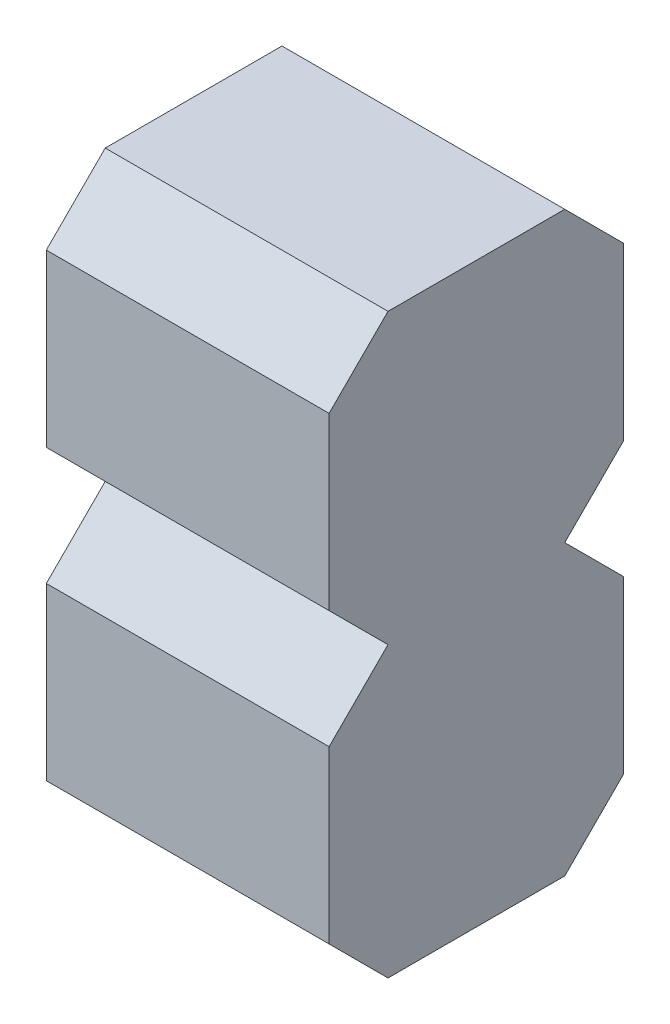
ISO-10303-21;
HEADER;
FILE_DESCRIPTION(('STEP AP214'),'2;1');
FILE_NAME('part.step','',(''),(''),'','','');
FILE_SCHEMA(('AUTOMOTIVE_DESIGN { 1 0 10303 214 1 1 1 1 }'));
ENDSEC;
DATA;
#1=APPLICATION_CONTEXT('core data for automotive mechanical design processes');
#2=APPLICATION_PROTOCOL_DEFINITION('international standard','automotive_design',2000,#1);
#3=PRODUCT_CONTEXT('',#1,'mechanical');
#4=PRODUCT('Part','Part','',(#3));
#5=PRODUCT_RELATED_PRODUCT_CATEGORY('part','',(#4));
#6=PRODUCT_DEFINITION_FORMATION('','',#4);
#7=PRODUCT_DEFINITION_CONTEXT('part definition',#1,'design');
#8=PRODUCT_DEFINITION('design','',#6,#7);
#9=PRODUCT_DEFINITION_SHAPE('','',#8);
#10=(LENGTH_UNIT() NAMED_UNIT(*) SI_UNIT(.MILLI.,.METRE.));
#11=(NAMED_UNIT(*) PLANE_ANGLE_UNIT() SI_UNIT($,.RADIAN.));
#12=(NAMED_UNIT(*) SI_UNIT($,.STERADIAN.) SOLID_ANGLE_UNIT());
#13=UNCERTAINTY_MEASURE_WITH_UNIT(LENGTH_MEASURE(1.E-05),#10,'distance_accuracy_value','');
#14=(GEOMETRIC_REPRESENTATION_CONTEXT(3) GLOBAL_UNCERTAINTY_ASSIGNED_CONTEXT((#13)) GLOBAL_UNIT_ASSIGNED_CONTEXT((#10,
#11,#12)) REPRESENTATION_CONTEXT('',''));
#15=CARTESIAN_POINT('',(0.,0.,0.));
#16=DIRECTION('',(0.,0.,1.));
#17=DIRECTION('',(1.,0.,0.));
#18=AXIS2_PLACEMENT_3D('',#15,#16,#17);
#19=CARTESIAN_POINT('',(0.,0.,0.));
#20=DIRECTION('',(0.,0.,1.));
#21=DIRECTION('',(1.,0.,0.));
#22=AXIS2_PLACEMENT_3D('',#19,#20,#21);
#23=PLANE('',#22);
#24=DIRECTION('',(0.,1.,0.));
#25=VECTOR('',#24,1.);
#26=CARTESIAN_POINT('',(0.,0.,0.));
#27=LINE('',#26,#25);
#28=CARTESIAN_POINT('',(0.,0.5,0.));
#29=VERTEX_POINT('',#28);
#30=CARTESIAN_POINT('',(0.,1.95,0.));
#31=VERTEX_POINT('',#30);
#32=EDGE_CURVE('E197',#29,#31,#27,.T.);
#33=ORIENTED_EDGE('',*,*,#32,.F.);
#34=DIRECTION('',(1.,0.,0.));
#35=VECTOR('',#34,1.);
#36=CARTESIAN_POINT('',(-2.5,0.5,0.));
#37=LINE('',#36,#35);
#38=CARTESIAN_POINT('',(-2.4,0.5,0.));
#39=VERTEX_POINT('',#38);
#40=EDGE_CURVE('E241',#39,#29,#37,.T.);
#41=ORIENTED_EDGE('',*,*,#40,.F.);
#42=DIRECTION('',(0.,-1.,0.));
#43=VECTOR('',#42,1.);
#44=CARTESIAN_POINT('',(-2.4,0.,0.));
#45=LINE('',#44,#43);
#46=CARTESIAN_POINT('',(-2.4,1.95,0.));
#47=VERTEX_POINT('',#46);
#48=EDGE_CURVE('E196',#47,#39,#45,.T.);
#49=ORIENTED_EDGE('',*,*,#48,.F.);
#50=DIRECTION('',(1.,0.,0.));
#51=VECTOR('',#50,1.);
#52=CARTESIAN_POINT('',(0.,1.95,0.));
#53=LINE('',#52,#51);
#54=EDGE_CURVE('E168',#47,#31,#53,.T.);
#55=ORIENTED_EDGE('',*,*,#54,.T.);
#56=EDGE_LOOP('',(#33,#41,#49,#55));
#57=FACE_BOUND('',#56,.T.);
#58=ADVANCED_FACE('F34',(#57),#23,.F.);
#59=CARTESIAN_POINT('',(0.,0.,2.5));
#60=DIRECTION('',(0.,0.,1.));
#61=DIRECTION('',(1.,0.,0.));
#62=AXIS2_PLACEMENT_3D('',#59,#60,#61);
#63=PLANE('',#62);
#64=DIRECTION('',(1.,0.,0.));
#65=VECTOR('',#64,1.);
#66=CARTESIAN_POINT('',(-2.5,4.39999999999999,2.5));
#67=LINE('',#66,#65);
#68=CARTESIAN_POINT('',(-2.4,4.39999999999999,2.5));
#69=VERTEX_POINT('',#68);
#70=CARTESIAN_POINT('',(0.,4.39999999999999,2.5));
#71=VERTEX_POINT('',#70);
#72=EDGE_CURVE('E228',#69,#71,#67,.T.);
#73=ORIENTED_EDGE('',*,*,#72,.F.);
#74=DIRECTION('',(0.,-1.,0.));
#75=VECTOR('',#74,1.);
#76=CARTESIAN_POINT('',(-2.4,0.,2.5));
#77=LINE('',#76,#75);
#78=CARTESIAN_POINT('',(-2.4,2.95,2.5));
#79=VERTEX_POINT('',#78);
#80=EDGE_CURVE('E188',#69,#79,#77,.T.);
#81=ORIENTED_EDGE('',*,*,#80,.T.);
#82=DIRECTION('',(-1.,0.,0.));
#83=VECTOR('',#82,1.);
#84=CARTESIAN_POINT('',(0.,2.95,2.5));
#85=LINE('',#84,#83);
#86=CARTESIAN_POINT('',(0.,2.95,2.5));
#87=VERTEX_POINT('',#86);
#88=EDGE_CURVE('E157',#87,#79,#85,.T.);
#89=ORIENTED_EDGE('',*,*,#88,.F.);
#90=DIRECTION('',(0.,1.,0.));
#91=VECTOR('',#90,1.);
#92=CARTESIAN_POINT('',(0.,0.,2.5));
#93=LINE('',#92,#91);
#94=EDGE_CURVE('E195',#87,#71,#93,.T.);
#95=ORIENTED_EDGE('',*,*,#94,.T.);
#96=EDGE_LOOP('',(#73,#81,#89,#95));
#97=FACE_BOUND('',#96,.T.);
#98=ADVANCED_FACE('F273',(#97),#63,.T.);
#99=CARTESIAN_POINT('',(0.,0.,2.5));
#100=DIRECTION('',(-1.,0.,0.));
#101=DIRECTION('',(0.,0.,1.));
#102=AXIS2_PLACEMENT_3D('',#99,#100,#101);
#103=PLANE('',#102);
#104=CARTESIAN_POINT('',(0.,2.95,0.));
#105=VERTEX_POINT('',#104);
#106=CARTESIAN_POINT('',(0.,4.4,0.));
#107=VERTEX_POINT('',#106);
#108=EDGE_CURVE('E148',#105,#107,#27,.T.);
#109=ORIENTED_EDGE('',*,*,#108,.T.);
#110=DIRECTION('',(0.,-0.707106781186547,-0.707106781186548));
#111=VECTOR('',#110,1.);
#112=CARTESIAN_POINT('',(0.,4.4,0.));
#113=LINE('',#112,#111);
#114=CARTESIAN_POINT('',(0.,4.9,0.5));
#115=VERTEX_POINT('',#114);
#116=EDGE_CURVE('E49',#115,#107,#113,.T.);
#117=ORIENTED_EDGE('',*,*,#116,.F.);
#118=DIRECTION('',(0.,0.,-1.));
#119=VECTOR('',#118,1.);
#120=CARTESIAN_POINT('',(0.,4.9,2.5));
#121=LINE('',#120,#119);
#122=CARTESIAN_POINT('',(0.,4.9,2.));
#123=VERTEX_POINT('',#122);
#124=EDGE_CURVE('E145',#123,#115,#121,.T.);
#125=ORIENTED_EDGE('',*,*,#124,.F.);
#126=DIRECTION('',(0.,0.707106781186553,-0.707106781186542));
#127=VECTOR('',#126,1.);
#128=CARTESIAN_POINT('',(0.,4.9,2.));
#129=LINE('',#128,#127);
#130=EDGE_CURVE('E230',#71,#123,#129,.T.);
#131=ORIENTED_EDGE('',*,*,#130,.F.);
#132=ORIENTED_EDGE('',*,*,#94,.F.);
#133=DIRECTION('',(0.,0.707106781186548,0.707106781186548));
#134=VECTOR('',#133,1.);
#135=CARTESIAN_POINT('',(0.,2.95,2.5));
#136=LINE('',#135,#134);
#137=CARTESIAN_POINT('',(0.,2.45,2.));
#138=VERTEX_POINT('',#137);
#139=EDGE_CURVE('E209',#138,#87,#136,.T.);
#140=ORIENTED_EDGE('',*,*,#139,.F.);
#141=DIRECTION('',(0.,0.707106781186548,-0.707106781186548));
#142=VECTOR('',#141,1.);
#143=CARTESIAN_POINT('',(0.,2.45,2.));
#144=LINE('',#143,#142);
#145=CARTESIAN_POINT('',(0.,1.95,2.5));
#146=VERTEX_POINT('',#145);
#147=EDGE_CURVE('E211',#146,#138,#144,.T.);
#148=ORIENTED_EDGE('',*,*,#147,.F.);
#149=CARTESIAN_POINT('',(0.,0.5,2.5));
#150=VERTEX_POINT('',#149);
#151=EDGE_CURVE('E199',#150,#146,#93,.T.);
#152=ORIENTED_EDGE('',*,*,#151,.F.);
#153=DIRECTION('',(0.,0.707106781186544,0.707106781186552));
#154=VECTOR('',#153,1.);
#155=CARTESIAN_POINT('',(0.,0.5,2.5));
#156=LINE('',#155,#154);
#157=CARTESIAN_POINT('',(0.,0.,1.99999999999999));
#158=VERTEX_POINT('',#157);
#159=EDGE_CURVE('E187',#158,#150,#156,.T.);
#160=ORIENTED_EDGE('',*,*,#159,.F.);
#161=DIRECTION('',(0.,0.,-1.));
#162=VECTOR('',#161,1.);
#163=CARTESIAN_POINT('',(0.,0.,2.5));
#164=LINE('',#163,#162);
#165=CARTESIAN_POINT('',(0.,0.,0.5));
#166=VERTEX_POINT('',#165);
#167=EDGE_CURVE('E181',#158,#166,#164,.T.);
#168=ORIENTED_EDGE('',*,*,#167,.T.);
#169=DIRECTION('',(0.,-0.707106781186548,0.707106781186548));
#170=VECTOR('',#169,1.);
#171=CARTESIAN_POINT('',(0.,0.,0.5));
#172=LINE('',#171,#170);
#173=EDGE_CURVE('E56',#29,#166,#172,.T.);
#174=ORIENTED_EDGE('',*,*,#173,.F.);
#175=ORIENTED_EDGE('',*,*,#32,.T.);
#176=DIRECTION('',(0.,-0.707106781186547,-0.707106781186548));
#177=VECTOR('',#176,1.);
#178=CARTESIAN_POINT('',(0.,2.45,0.5));
#179=LINE('',#178,#177);
#180=CARTESIAN_POINT('',(0.,2.45,0.5));
#181=VERTEX_POINT('',#180);
#182=EDGE_CURVE('E222',#181,#31,#179,.T.);
#183=ORIENTED_EDGE('',*,*,#182,.F.);
#184=DIRECTION('',(0.,-0.707106781186547,0.707106781186548));
#185=VECTOR('',#184,1.);
#186=CARTESIAN_POINT('',(0.,2.95,0.));
#187=LINE('',#186,#185);
#188=EDGE_CURVE('E225',#105,#181,#187,.T.);
#189=ORIENTED_EDGE('',*,*,#188,.F.);
#190=EDGE_LOOP('',(#109,#117,#125,#131,#132,#140,#148,#152,#160,#168,#174,#175,#183,#189));
#191=FACE_BOUND('',#190,.T.);
#192=ADVANCED_FACE('F36',(#191),#103,.F.);
#193=CARTESIAN_POINT('',(0.,4.9,2.5));
#194=DIRECTION('',(0.,-1.,0.));
#195=DIRECTION('',(0.,0.,-1.));
#196=AXIS2_PLACEMENT_3D('',#193,#194,#195);
#197=PLANE('',#196);
#198=ORIENTED_EDGE('',*,*,#124,.T.);
#199=DIRECTION('',(1.,0.,0.));
#200=VECTOR('',#199,1.);
#201=CARTESIAN_POINT('',(-2.5,4.9,0.5));
#202=LINE('',#201,#200);
#203=CARTESIAN_POINT('',(-2.4,4.9,0.5));
#204=VERTEX_POINT('',#203);
#205=EDGE_CURVE('E132',#204,#115,#202,.T.);
#206=ORIENTED_EDGE('',*,*,#205,.F.);
#207=DIRECTION('',(0.,0.,-1.));
#208=VECTOR('',#207,1.);
#209=CARTESIAN_POINT('',(-2.4,4.9,2.5));
#210=LINE('',#209,#208);
#211=CARTESIAN_POINT('',(-2.4,4.9,2.));
#212=VERTEX_POINT('',#211);
#213=EDGE_CURVE('E154',#212,#204,#210,.T.);
#214=ORIENTED_EDGE('',*,*,#213,.F.);
#215=DIRECTION('',(1.,0.,0.));
#216=VECTOR('',#215,1.);
#217=CARTESIAN_POINT('',(-2.5,4.9,2.));
#218=LINE('',#217,#216);
#219=EDGE_CURVE('E152',#212,#123,#218,.T.);
#220=ORIENTED_EDGE('',*,*,#219,.T.);
#221=EDGE_LOOP('',(#198,#206,#214,#220));
#222=FACE_BOUND('',#221,.T.);
#223=ADVANCED_FACE('F151',(#222),#197,.F.);
#224=CARTESIAN_POINT('',(-2.4,0.,2.5));
#225=DIRECTION('',(1.,0.,0.));
#226=DIRECTION('',(0.,0.,-1.));
#227=AXIS2_PLACEMENT_3D('',#224,#225,#226);
#228=PLANE('',#227);
#229=ORIENTED_EDGE('',*,*,#213,.T.);
#230=DIRECTION('',(0.,-0.707106781186547,-0.707106781186548));
#231=VECTOR('',#230,1.);
#232=CARTESIAN_POINT('',(-2.4,3.45,-0.949999999999999));
#233=LINE('',#232,#231);
#234=CARTESIAN_POINT('',(-2.4,4.4,0.));
#235=VERTEX_POINT('',#234);
#236=EDGE_CURVE('E135',#204,#235,#233,.T.);
#237=ORIENTED_EDGE('',*,*,#236,.T.);
#238=CARTESIAN_POINT('',(-2.4,2.95,0.));
#239=VERTEX_POINT('',#238);
#240=EDGE_CURVE('E193',#235,#239,#45,.T.);
#241=ORIENTED_EDGE('',*,*,#240,.T.);
#242=DIRECTION('',(0.,-0.707106781186547,0.707106781186548));
#243=VECTOR('',#242,1.);
#244=CARTESIAN_POINT('',(-2.4,0.225,2.725));
#245=LINE('',#244,#243);
#246=CARTESIAN_POINT('',(-2.4,2.45,0.5));
#247=VERTEX_POINT('',#246);
#248=EDGE_CURVE('E217',#239,#247,#245,.T.);
#249=ORIENTED_EDGE('',*,*,#248,.T.);
#250=DIRECTION('',(0.,-0.707106781186547,-0.707106781186548));
#251=VECTOR('',#250,1.);
#252=CARTESIAN_POINT('',(-2.4,2.225,0.275));
#253=LINE('',#252,#251);
#254=EDGE_CURVE('E214',#247,#47,#253,.T.);
#255=ORIENTED_EDGE('',*,*,#254,.T.);
#256=ORIENTED_EDGE('',*,*,#48,.T.);
#257=DIRECTION('',(0.,-0.707106781186548,0.707106781186548));
#258=VECTOR('',#257,1.);
#259=CARTESIAN_POINT('',(-2.4,-1.,1.5));
#260=LINE('',#259,#258);
#261=CARTESIAN_POINT('',(-2.4,0.,0.5));
#262=VERTEX_POINT('',#261);
#263=EDGE_CURVE('E239',#39,#262,#260,.T.);
#264=ORIENTED_EDGE('',*,*,#263,.T.);
#265=DIRECTION('',(0.,0.,-1.));
#266=VECTOR('',#265,1.);
#267=CARTESIAN_POINT('',(-2.4,0.,2.5));
#268=LINE('',#267,#266);
#269=CARTESIAN_POINT('',(-2.4,0.,1.99999999999999));
#270=VERTEX_POINT('',#269);
#271=EDGE_CURVE('E159',#270,#262,#268,.T.);
#272=ORIENTED_EDGE('',*,*,#271,.F.);
#273=DIRECTION('',(0.,0.707106781186544,0.707106781186551));
#274=VECTOR('',#273,1.);
#275=CARTESIAN_POINT('',(-2.4,0.250000000000003,2.25));
#276=LINE('',#275,#274);
#277=CARTESIAN_POINT('',(-2.4,0.5,2.5));
#278=VERTEX_POINT('',#277);
#279=EDGE_CURVE('E233',#270,#278,#276,.T.);
#280=ORIENTED_EDGE('',*,*,#279,.T.);
#281=CARTESIAN_POINT('',(-2.4,1.95,2.5));
#282=VERTEX_POINT('',#281);
#283=EDGE_CURVE('E190',#282,#278,#77,.T.);
#284=ORIENTED_EDGE('',*,*,#283,.F.);
#285=DIRECTION('',(0.,0.707106781186548,-0.707106781186548));
#286=VECTOR('',#285,1.);
#287=CARTESIAN_POINT('',(-2.4,0.975,3.475));
#288=LINE('',#287,#286);
#289=CARTESIAN_POINT('',(-2.4,2.45,2.));
#290=VERTEX_POINT('',#289);
#291=EDGE_CURVE('E204',#282,#290,#288,.T.);
#292=ORIENTED_EDGE('',*,*,#291,.T.);
#293=DIRECTION('',(0.,0.707106781186548,0.707106781186548));
#294=VECTOR('',#293,1.);
#295=CARTESIAN_POINT('',(-2.4,1.475,1.025));
#296=LINE('',#295,#294);
#297=EDGE_CURVE('E201',#290,#79,#296,.T.);
#298=ORIENTED_EDGE('',*,*,#297,.T.);
#299=ORIENTED_EDGE('',*,*,#80,.F.);
#300=DIRECTION('',(0.,0.707106781186553,-0.707106781186542));
#301=VECTOR('',#300,1.);
#302=CARTESIAN_POINT('',(-2.4,2.19999999999996,4.7));
#303=LINE('',#302,#301);
#304=EDGE_CURVE('E171',#69,#212,#303,.T.);
#305=ORIENTED_EDGE('',*,*,#304,.T.);
#306=EDGE_LOOP('',(#229,#237,#241,#249,#255,#256,#264,#272,#280,#284,#292,#298,#299,#305));
#307=FACE_BOUND('',#306,.T.);
#308=ADVANCED_FACE('F246',(#307),#228,.F.);
#309=CARTESIAN_POINT('',(0.,0.,2.5));
#310=DIRECTION('',(0.,1.,0.));
#311=DIRECTION('',(0.,0.,1.));
#312=AXIS2_PLACEMENT_3D('',#309,#310,#311);
#313=PLANE('',#312);
#314=ORIENTED_EDGE('',*,*,#271,.T.);
#315=DIRECTION('',(1.,0.,0.));
#316=VECTOR('',#315,1.);
#317=CARTESIAN_POINT('',(0.,0.,0.5));
#318=LINE('',#317,#316);
#319=EDGE_CURVE('E42',#262,#166,#318,.T.);
#320=ORIENTED_EDGE('',*,*,#319,.T.);
#321=ORIENTED_EDGE('',*,*,#167,.F.);
#322=DIRECTION('',(1.,0.,0.));
#323=VECTOR('',#322,1.);
#324=CARTESIAN_POINT('',(-2.5,0.,1.99999999999999));
#325=LINE('',#324,#323);
#326=EDGE_CURVE('E236',#270,#158,#325,.T.);
#327=ORIENTED_EDGE('',*,*,#326,.F.);
#328=EDGE_LOOP('',(#314,#320,#321,#327));
#329=FACE_BOUND('',#328,.T.);
#330=ADVANCED_FACE('F179',(#329),#313,.F.);
#331=DIRECTION('',(-1.,0.,0.));
#332=VECTOR('',#331,1.);
#333=CARTESIAN_POINT('',(0.,0.5,2.5));
#334=LINE('',#333,#332);
#335=EDGE_CURVE('E174',#150,#278,#334,.T.);
#336=ORIENTED_EDGE('',*,*,#335,.F.);
#337=ORIENTED_EDGE('',*,*,#151,.T.);
#338=DIRECTION('',(1.,0.,0.));
#339=VECTOR('',#338,1.);
#340=CARTESIAN_POINT('',(0.,1.95,2.5));
#341=LINE('',#340,#339);
#342=EDGE_CURVE('E153',#282,#146,#341,.T.);
#343=ORIENTED_EDGE('',*,*,#342,.F.);
#344=ORIENTED_EDGE('',*,*,#283,.T.);
#345=EDGE_LOOP('',(#336,#337,#343,#344));
#346=FACE_BOUND('',#345,.T.);
#347=ADVANCED_FACE('F280',(#346),#63,.T.);
#348=ORIENTED_EDGE('',*,*,#240,.F.);
#349=DIRECTION('',(1.,0.,0.));
#350=VECTOR('',#349,1.);
#351=CARTESIAN_POINT('',(0.,4.4,0.));
#352=LINE('',#351,#350);
#353=EDGE_CURVE('E11',#235,#107,#352,.T.);
#354=ORIENTED_EDGE('',*,*,#353,.T.);
#355=ORIENTED_EDGE('',*,*,#108,.F.);
#356=DIRECTION('',(-1.,0.,0.));
#357=VECTOR('',#356,1.);
#358=CARTESIAN_POINT('',(0.,2.95,0.));
#359=LINE('',#358,#357);
#360=EDGE_CURVE('E165',#105,#239,#359,.T.);
#361=ORIENTED_EDGE('',*,*,#360,.T.);
#362=EDGE_LOOP('',(#348,#354,#355,#361));
#363=FACE_BOUND('',#362,.T.);
#364=ADVANCED_FACE('F249',(#363),#23,.F.);
#365=CARTESIAN_POINT('',(-2.5,2.95,2.5));
#366=DIRECTION('',(0.,0.707106781186548,-0.707106781186548));
#367=DIRECTION('',(0.,0.707106781186548,0.707106781186548));
#368=AXIS2_PLACEMENT_3D('',#365,#366,#367);
#369=PLANE('',#368);
#370=DIRECTION('',(1.,0.,0.));
#371=VECTOR('',#370,1.);
#372=CARTESIAN_POINT('',(-2.5,2.45,2.));
#373=LINE('',#372,#371);
#374=EDGE_CURVE('E207',#290,#138,#373,.T.);
#375=ORIENTED_EDGE('',*,*,#374,.T.);
#376=ORIENTED_EDGE('',*,*,#139,.T.);
#377=ORIENTED_EDGE('',*,*,#88,.T.);
#378=ORIENTED_EDGE('',*,*,#297,.F.);
#379=EDGE_LOOP('',(#375,#376,#377,#378));
#380=FACE_BOUND('',#379,.T.);
#381=ADVANCED_FACE('F283',(#380),#369,.F.);
#382=CARTESIAN_POINT('',(-2.5,2.45,2.));
#383=DIRECTION('',(0.,-0.707106781186548,-0.707106781186548));
#384=DIRECTION('',(0.,0.707106781186548,-0.707106781186548));
#385=AXIS2_PLACEMENT_3D('',#382,#383,#384);
#386=PLANE('',#385);
#387=ORIENTED_EDGE('',*,*,#342,.T.);
#388=ORIENTED_EDGE('',*,*,#147,.T.);
#389=ORIENTED_EDGE('',*,*,#374,.F.);
#390=ORIENTED_EDGE('',*,*,#291,.F.);
#391=EDGE_LOOP('',(#387,#388,#389,#390));
#392=FACE_BOUND('',#391,.T.);
#393=ADVANCED_FACE('F288',(#392),#386,.F.);
#394=CARTESIAN_POINT('',(-2.5,2.45,0.5));
#395=DIRECTION('',(0.,-0.707106781186548,0.707106781186547));
#396=DIRECTION('',(0.,-0.707106781186547,-0.707106781186548));
#397=AXIS2_PLACEMENT_3D('',#394,#395,#396);
#398=PLANE('',#397);
#399=DIRECTION('',(1.,0.,0.));
#400=VECTOR('',#399,1.);
#401=CARTESIAN_POINT('',(-2.5,2.45,0.5));
#402=LINE('',#401,#400);
#403=EDGE_CURVE('E220',#247,#181,#402,.T.);
#404=ORIENTED_EDGE('',*,*,#403,.T.);
#405=ORIENTED_EDGE('',*,*,#182,.T.);
#406=ORIENTED_EDGE('',*,*,#54,.F.);
#407=ORIENTED_EDGE('',*,*,#254,.F.);
#408=EDGE_LOOP('',(#404,#405,#406,#407));
#409=FACE_BOUND('',#408,.T.);
#410=ADVANCED_FACE('F255',(#409),#398,.F.);
#411=CARTESIAN_POINT('',(-2.5,2.95,0.));
#412=DIRECTION('',(0.,0.707106781186548,0.707106781186547));
#413=DIRECTION('',(0.,-0.707106781186547,0.707106781186548));
#414=AXIS2_PLACEMENT_3D('',#411,#412,#413);
#415=PLANE('',#414);
#416=ORIENTED_EDGE('',*,*,#360,.F.);
#417=ORIENTED_EDGE('',*,*,#188,.T.);
#418=ORIENTED_EDGE('',*,*,#403,.F.);
#419=ORIENTED_EDGE('',*,*,#248,.F.);
#420=EDGE_LOOP('',(#416,#417,#418,#419));
#421=FACE_BOUND('',#420,.T.);
#422=ADVANCED_FACE('F251',(#421),#415,.F.);
#423=CARTESIAN_POINT('',(-2.5,4.9,2.));
#424=DIRECTION('',(0.,-0.707106781186542,-0.707106781186553));
#425=DIRECTION('',(0.,0.707106781186553,-0.707106781186542));
#426=AXIS2_PLACEMENT_3D('',#423,#424,#425);
#427=PLANE('',#426);
#428=ORIENTED_EDGE('',*,*,#72,.T.);
#429=ORIENTED_EDGE('',*,*,#130,.T.);
#430=ORIENTED_EDGE('',*,*,#219,.F.);
#431=ORIENTED_EDGE('',*,*,#304,.F.);
#432=EDGE_LOOP('',(#428,#429,#430,#431));
#433=FACE_BOUND('',#432,.T.);
#434=ADVANCED_FACE('F269',(#433),#427,.F.);
#435=CARTESIAN_POINT('',(-2.5,0.5,2.5));
#436=DIRECTION('',(0.,0.707106781186552,-0.707106781186544));
#437=DIRECTION('',(0.,0.707106781186544,0.707106781186551));
#438=AXIS2_PLACEMENT_3D('',#435,#436,#437);
#439=PLANE('',#438);
#440=ORIENTED_EDGE('',*,*,#326,.T.);
#441=ORIENTED_EDGE('',*,*,#159,.T.);
#442=ORIENTED_EDGE('',*,*,#335,.T.);
#443=ORIENTED_EDGE('',*,*,#279,.F.);
#444=EDGE_LOOP('',(#440,#441,#442,#443));
#445=FACE_BOUND('',#444,.T.);
#446=ADVANCED_FACE('F262',(#445),#439,.F.);
#447=CARTESIAN_POINT('',(-2.5,0.,0.5));
#448=DIRECTION('',(0.,0.707106781186548,0.707106781186548));
#449=DIRECTION('',(0.,-0.707106781186548,0.707106781186548));
#450=AXIS2_PLACEMENT_3D('',#447,#448,#449);
#451=PLANE('',#450);
#452=ORIENTED_EDGE('',*,*,#40,.T.);
#453=ORIENTED_EDGE('',*,*,#173,.T.);
#454=ORIENTED_EDGE('',*,*,#319,.F.);
#455=ORIENTED_EDGE('',*,*,#263,.F.);
#456=EDGE_LOOP('',(#452,#453,#454,#455));
#457=FACE_BOUND('',#456,.T.);
#458=ADVANCED_FACE('F260',(#457),#451,.F.);
#459=CARTESIAN_POINT('',(-2.5,4.4,0.));
#460=DIRECTION('',(0.,-0.707106781186548,0.707106781186547));
#461=DIRECTION('',(0.,-0.707106781186547,-0.707106781186548));
#462=AXIS2_PLACEMENT_3D('',#459,#460,#461);
#463=PLANE('',#462);
#464=ORIENTED_EDGE('',*,*,#205,.T.);
#465=ORIENTED_EDGE('',*,*,#116,.T.);
#466=ORIENTED_EDGE('',*,*,#353,.F.);
#467=ORIENTED_EDGE('',*,*,#236,.F.);
#468=EDGE_LOOP('',(#464,#465,#466,#467));
#469=FACE_BOUND('',#468,.T.);
#470=ADVANCED_FACE('F133',(#469),#463,.F.);
#471=CLOSED_SHELL('',(#58,#98,#192,#223,#308,#330,#347,#364,#381,#393,#410,#422,#434,#446,#458,#470));
#472=MANIFOLD_SOLID_BREP('B2',#471);
#473=ADVANCED_BREP_SHAPE_REPRESENTATION('',(#18,#472),#14);
#474=SHAPE_DEFINITION_REPRESENTATION(#9,#473);
ENDSEC;
END-ISO-10303-21;
